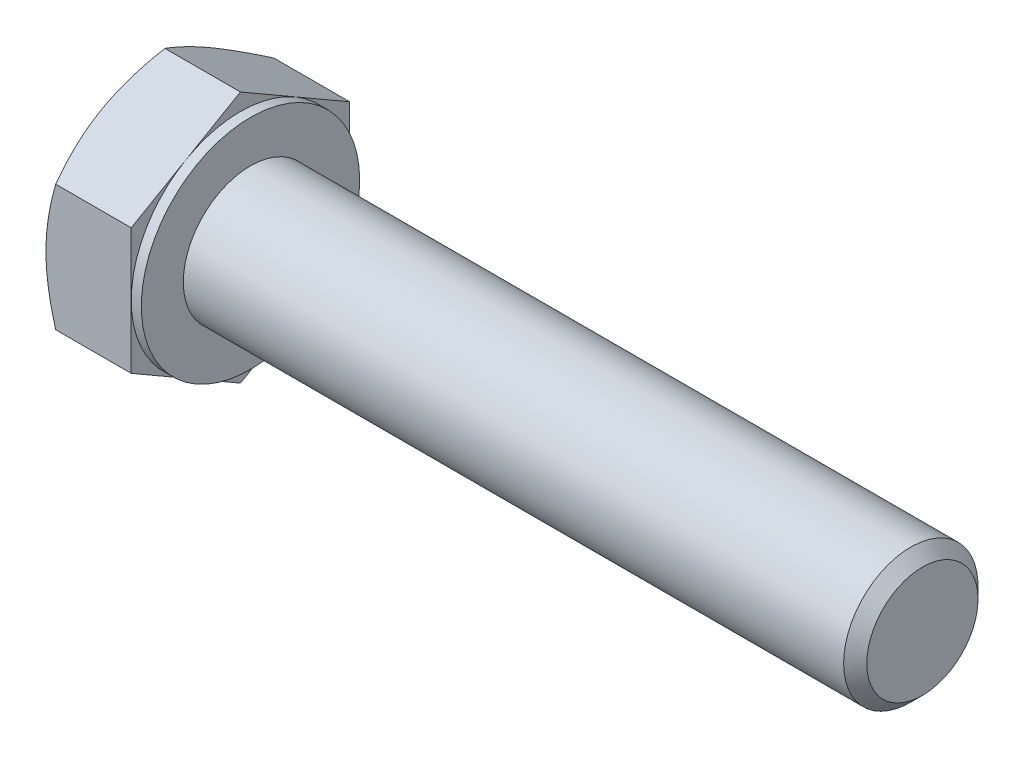
ISO-10303-21;
HEADER;
FILE_DESCRIPTION(('STEP AP214'),'2;1');
FILE_NAME('part.step','',(''),(''),'','','');
FILE_SCHEMA(('AUTOMOTIVE_DESIGN { 1 0 10303 214 1 1 1 1 }'));
ENDSEC;
DATA;
#1=APPLICATION_CONTEXT('core data for automotive mechanical design processes');
#2=APPLICATION_PROTOCOL_DEFINITION('international standard','automotive_design',2000,#1);
#3=PRODUCT_CONTEXT('',#1,'mechanical');
#4=PRODUCT('Part','Part','',(#3));
#5=PRODUCT_RELATED_PRODUCT_CATEGORY('part','',(#4));
#6=PRODUCT_DEFINITION_FORMATION('','',#4);
#7=PRODUCT_DEFINITION_CONTEXT('part definition',#1,'design');
#8=PRODUCT_DEFINITION('design','',#6,#7);
#9=PRODUCT_DEFINITION_SHAPE('','',#8);
#10=(LENGTH_UNIT() NAMED_UNIT(*) SI_UNIT(.MILLI.,.METRE.));
#11=(NAMED_UNIT(*) PLANE_ANGLE_UNIT() SI_UNIT($,.RADIAN.));
#12=(NAMED_UNIT(*) SI_UNIT($,.STERADIAN.) SOLID_ANGLE_UNIT());
#13=UNCERTAINTY_MEASURE_WITH_UNIT(LENGTH_MEASURE(1.E-05),#10,'distance_accuracy_value','');
#14=(GEOMETRIC_REPRESENTATION_CONTEXT(3) GLOBAL_UNCERTAINTY_ASSIGNED_CONTEXT((#13)) GLOBAL_UNIT_ASSIGNED_CONTEXT((#10,
#11,#12)) REPRESENTATION_CONTEXT('',''));
#15=CARTESIAN_POINT('',(0.,0.,0.));
#16=DIRECTION('',(0.,0.,1.));
#17=DIRECTION('',(1.,0.,0.));
#18=AXIS2_PLACEMENT_3D('',#15,#16,#17);
#19=CARTESIAN_POINT('',(5.675,7.50555349946514,0.));
#20=DIRECTION('',(1.,0.,0.));
#21=DIRECTION('',(0.,0.,-1.));
#22=AXIS2_PLACEMENT_3D('',#19,#20,#21);
#23=PLANE('',#22);
#24=CARTESIAN_POINT('',(5.675,0.,0.));
#25=DIRECTION('',(1.,0.,0.));
#26=DIRECTION('',(0.,0.,-1.));
#27=AXIS2_PLACEMENT_3D('',#24,#25,#26);
#28=CIRCLE('',#27,4.);
#29=CARTESIAN_POINT('',(5.675,0.,-4.));
#30=VERTEX_POINT('',#29);
#31=EDGE_CURVE('E275',#30,#30,#28,.F.);
#32=ORIENTED_EDGE('',*,*,#31,.T.);
#33=EDGE_LOOP('',(#32));
#34=FACE_BOUND('',#33,.T.);
#35=CARTESIAN_POINT('',(5.675,0.,0.));
#36=DIRECTION('',(1.,0.,0.));
#37=DIRECTION('',(0.,0.,-1.));
#38=AXIS2_PLACEMENT_3D('',#35,#36,#37);
#39=CIRCLE('',#38,6.5);
#40=CARTESIAN_POINT('',(5.675,0.,-6.5));
#41=VERTEX_POINT('',#40);
#42=EDGE_CURVE('E294',#41,#41,#39,.T.);
#43=ORIENTED_EDGE('',*,*,#42,.T.);
#44=EDGE_LOOP('',(#43));
#45=FACE_BOUND('',#44,.T.);
#46=ADVANCED_FACE('F37',(#34,#45),#23,.T.);
#47=CARTESIAN_POINT('',(0.,0.,0.));
#48=DIRECTION('',(-1.,0.,0.));
#49=DIRECTION('',(0.,0.,1.));
#50=AXIS2_PLACEMENT_3D('',#47,#48,#49);
#51=CYLINDRICAL_SURFACE('',#50,4.);
#52=ORIENTED_EDGE('',*,*,#31,.F.);
#53=EDGE_LOOP('',(#52));
#54=FACE_BOUND('',#53,.T.);
#55=CARTESIAN_POINT('',(44.9845,0.,0.));
#56=DIRECTION('',(-1.,0.,0.));
#57=DIRECTION('',(0.,0.,1.));
#58=AXIS2_PLACEMENT_3D('',#55,#56,#57);
#59=CIRCLE('',#58,4.);
#60=CARTESIAN_POINT('',(44.9845,0.,4.));
#61=VERTEX_POINT('',#60);
#62=EDGE_CURVE('E272',#61,#61,#59,.T.);
#63=ORIENTED_EDGE('',*,*,#62,.T.);
#64=EDGE_LOOP('',(#63));
#65=FACE_BOUND('',#64,.T.);
#66=ADVANCED_FACE('F246',(#54,#65),#51,.T.);
#67=CARTESIAN_POINT('',(45.675,0.,0.));
#68=DIRECTION('',(-1.,0.,0.));
#69=DIRECTION('',(0.,0.,1.));
#70=AXIS2_PLACEMENT_3D('',#67,#68,#69);
#71=CONICAL_SURFACE('',#70,3.3095,0.785398163397473);
#72=ORIENTED_EDGE('',*,*,#62,.F.);
#73=EDGE_LOOP('',(#72));
#74=FACE_BOUND('',#73,.T.);
#75=CARTESIAN_POINT('',(45.675,0.,0.));
#76=DIRECTION('',(-1.,0.,0.));
#77=DIRECTION('',(0.,0.,1.));
#78=AXIS2_PLACEMENT_3D('',#75,#76,#77);
#79=CIRCLE('',#78,3.3095);
#80=CARTESIAN_POINT('',(45.675,0.,3.3095));
#81=VERTEX_POINT('',#80);
#82=EDGE_CURVE('E270',#81,#81,#79,.T.);
#83=ORIENTED_EDGE('',*,*,#82,.T.);
#84=EDGE_LOOP('',(#83));
#85=FACE_BOUND('',#84,.T.);
#86=ADVANCED_FACE('F251',(#74,#85),#71,.T.);
#87=CARTESIAN_POINT('',(45.675,0.,0.));
#88=DIRECTION('',(-1.,0.,0.));
#89=DIRECTION('',(0.,0.,1.));
#90=AXIS2_PLACEMENT_3D('',#87,#88,#89);
#91=PLANE('',#90);
#92=ORIENTED_EDGE('',*,*,#82,.F.);
#93=EDGE_LOOP('',(#92));
#94=FACE_BOUND('',#93,.T.);
#95=ADVANCED_FACE('F258',(#94),#91,.F.);
#96=CARTESIAN_POINT('',(5.075,6.5,0.));
#97=DIRECTION('',(1.,0.,0.));
#98=DIRECTION('',(0.,0.,-1.));
#99=AXIS2_PLACEMENT_3D('',#96,#97,#98);
#100=PLANE('',#99);
#101=DIRECTION('',(0.,0.500000000000001,0.866025403784438));
#102=VECTOR('',#101,1.);
#103=CARTESIAN_POINT('',(5.075,3.75277674973256,-6.5));
#104=LINE('',#103,#102);
#105=CARTESIAN_POINT('',(5.075,3.75277674973256,-6.5));
#106=VERTEX_POINT('',#105);
#107=CARTESIAN_POINT('',(5.075,5.62916512459884,-3.25000000000001));
#108=VERTEX_POINT('',#107);
#109=EDGE_CURVE('E170',#106,#108,#104,.T.);
#110=ORIENTED_EDGE('',*,*,#109,.T.);
#111=CARTESIAN_POINT('',(5.075,0.,0.));
#112=DIRECTION('',(-1.,0.,0.));
#113=DIRECTION('',(0.,0.,1.));
#114=AXIS2_PLACEMENT_3D('',#111,#112,#113);
#115=CIRCLE('',#114,6.5);
#116=CARTESIAN_POINT('',(5.075,0.,-6.5));
#117=VERTEX_POINT('',#116);
#118=EDGE_CURVE('E53',#108,#117,#115,.T.);
#119=ORIENTED_EDGE('',*,*,#118,.T.);
#120=DIRECTION('',(0.,1.,0.));
#121=VECTOR('',#120,1.);
#122=CARTESIAN_POINT('',(5.075,3.75277674973256,-6.5));
#123=LINE('',#122,#121);
#124=EDGE_CURVE('E42',#117,#106,#123,.T.);
#125=ORIENTED_EDGE('',*,*,#124,.T.);
#126=EDGE_LOOP('',(#110,#119,#125));
#127=FACE_BOUND('',#126,.T.);
#128=ADVANCED_FACE('F261',(#127),#100,.T.);
#129=CARTESIAN_POINT('',(5.075,7.50555349946514,0.));
#130=VERTEX_POINT('',#129);
#131=EDGE_CURVE('E168',#108,#130,#104,.T.);
#132=ORIENTED_EDGE('',*,*,#131,.T.);
#133=DIRECTION('',(0.,-0.500000000000001,0.866025403784438));
#134=VECTOR('',#133,1.);
#135=CARTESIAN_POINT('',(5.075,7.50555349946514,0.));
#136=LINE('',#135,#134);
#137=CARTESIAN_POINT('',(5.075,5.62916512459885,3.25));
#138=VERTEX_POINT('',#137);
#139=EDGE_CURVE('E167',#130,#138,#136,.T.);
#140=ORIENTED_EDGE('',*,*,#139,.T.);
#141=EDGE_CURVE('E156',#138,#108,#115,.T.);
#142=ORIENTED_EDGE('',*,*,#141,.T.);
#143=EDGE_LOOP('',(#132,#140,#142));
#144=FACE_BOUND('',#143,.T.);
#145=ADVANCED_FACE('F266',(#144),#100,.T.);
#146=CARTESIAN_POINT('',(5.075,3.75277674973257,6.5));
#147=VERTEX_POINT('',#146);
#148=EDGE_CURVE('E135',#138,#147,#136,.T.);
#149=ORIENTED_EDGE('',*,*,#148,.T.);
#150=DIRECTION('',(0.,-1.,0.));
#151=VECTOR('',#150,1.);
#152=CARTESIAN_POINT('',(5.075,3.75277674973257,6.5));
#153=LINE('',#152,#151);
#154=CARTESIAN_POINT('',(5.075,0.,6.5));
#155=VERTEX_POINT('',#154);
#156=EDGE_CURVE('E129',#147,#155,#153,.T.);
#157=ORIENTED_EDGE('',*,*,#156,.T.);
#158=EDGE_CURVE('E133',#155,#138,#115,.T.);
#159=ORIENTED_EDGE('',*,*,#158,.T.);
#160=EDGE_LOOP('',(#149,#157,#159));
#161=FACE_BOUND('',#160,.T.);
#162=ADVANCED_FACE('F131',(#161),#100,.T.);
#163=CARTESIAN_POINT('',(5.075,-3.75277674973256,6.5));
#164=VERTEX_POINT('',#163);
#165=EDGE_CURVE('E139',#155,#164,#153,.T.);
#166=ORIENTED_EDGE('',*,*,#165,.T.);
#167=DIRECTION('',(0.,-0.500000000000001,-0.866025403784438));
#168=VECTOR('',#167,1.);
#169=CARTESIAN_POINT('',(5.075,-7.50555349946514,0.));
#170=LINE('',#169,#168);
#171=CARTESIAN_POINT('',(5.075,-5.62916512459884,3.25000000000001));
#172=VERTEX_POINT('',#171);
#173=EDGE_CURVE('E146',#164,#172,#170,.T.);
#174=ORIENTED_EDGE('',*,*,#173,.T.);
#175=EDGE_CURVE('E143',#172,#155,#115,.T.);
#176=ORIENTED_EDGE('',*,*,#175,.T.);
#177=EDGE_LOOP('',(#166,#174,#176));
#178=FACE_BOUND('',#177,.T.);
#179=ADVANCED_FACE('F144',(#178),#100,.T.);
#180=CARTESIAN_POINT('',(5.075,-7.50555349946514,0.));
#181=VERTEX_POINT('',#180);
#182=EDGE_CURVE('E162',#172,#181,#170,.T.);
#183=ORIENTED_EDGE('',*,*,#182,.T.);
#184=DIRECTION('',(0.,0.5,-0.866025403784439));
#185=VECTOR('',#184,1.);
#186=CARTESIAN_POINT('',(5.075,-3.75277674973257,-6.5));
#187=LINE('',#186,#185);
#188=CARTESIAN_POINT('',(5.075,-5.62916512459885,-3.25));
#189=VERTEX_POINT('',#188);
#190=EDGE_CURVE('E330',#181,#189,#187,.T.);
#191=ORIENTED_EDGE('',*,*,#190,.T.);
#192=EDGE_CURVE('E150',#189,#172,#115,.T.);
#193=ORIENTED_EDGE('',*,*,#192,.T.);
#194=EDGE_LOOP('',(#183,#191,#193));
#195=FACE_BOUND('',#194,.T.);
#196=ADVANCED_FACE('F335',(#195),#100,.T.);
#197=CARTESIAN_POINT('',(5.075,-3.75277674973258,-6.5));
#198=VERTEX_POINT('',#197);
#199=EDGE_CURVE('E157',#189,#198,#187,.T.);
#200=ORIENTED_EDGE('',*,*,#199,.T.);
#201=EDGE_CURVE('E11',#198,#117,#123,.T.);
#202=ORIENTED_EDGE('',*,*,#201,.T.);
#203=EDGE_CURVE('E348',#117,#189,#115,.T.);
#204=ORIENTED_EDGE('',*,*,#203,.T.);
#205=EDGE_LOOP('',(#200,#202,#204));
#206=FACE_BOUND('',#205,.T.);
#207=ADVANCED_FACE('F267',(#206),#100,.T.);
#208=CARTESIAN_POINT('',(0.,0.,0.));
#209=DIRECTION('',(-1.,0.,0.));
#210=DIRECTION('',(0.,0.,1.));
#211=AXIS2_PLACEMENT_3D('',#208,#209,#210);
#212=CYLINDRICAL_SURFACE('',#211,6.5);
#213=ORIENTED_EDGE('',*,*,#118,.F.);
#214=ORIENTED_EDGE('',*,*,#141,.F.);
#215=ORIENTED_EDGE('',*,*,#158,.F.);
#216=ORIENTED_EDGE('',*,*,#175,.F.);
#217=ORIENTED_EDGE('',*,*,#192,.F.);
#218=ORIENTED_EDGE('',*,*,#203,.F.);
#219=EDGE_LOOP('',(#213,#214,#215,#216,#217,#218));
#220=FACE_BOUND('',#219,.T.);
#221=ORIENTED_EDGE('',*,*,#42,.F.);
#222=EDGE_LOOP('',(#221));
#223=FACE_BOUND('',#222,.T.);
#224=ADVANCED_FACE('F153',(#220,#223),#212,.T.);
#225=CARTESIAN_POINT('',(0.,7.50555349946514,0.));
#226=DIRECTION('',(1.,0.,0.));
#227=DIRECTION('',(0.,0.,-1.));
#228=AXIS2_PLACEMENT_3D('',#225,#226,#227);
#229=PLANE('',#228);
#230=CARTESIAN_POINT('',(0.,0.,0.));
#231=DIRECTION('',(1.,0.,0.));
#232=DIRECTION('',(0.,0.,-1.));
#233=AXIS2_PLACEMENT_3D('',#230,#231,#232);
#234=CIRCLE('',#233,6.5);
#235=CARTESIAN_POINT('',(0.,0.,-6.5));
#236=VERTEX_POINT('',#235);
#237=CARTESIAN_POINT('',(0.,5.62916512459885,-3.25000000000001));
#238=VERTEX_POINT('',#237);
#239=EDGE_CURVE('E293',#236,#238,#234,.T.);
#240=ORIENTED_EDGE('',*,*,#239,.F.);
#241=CARTESIAN_POINT('',(0.,-5.62916512459885,-3.25));
#242=VERTEX_POINT('',#241);
#243=EDGE_CURVE('E290',#242,#236,#234,.T.);
#244=ORIENTED_EDGE('',*,*,#243,.F.);
#245=CARTESIAN_POINT('',(0.,-5.62916512459884,3.25000000000001));
#246=VERTEX_POINT('',#245);
#247=EDGE_CURVE('E292',#246,#242,#234,.T.);
#248=ORIENTED_EDGE('',*,*,#247,.F.);
#249=CARTESIAN_POINT('',(0.,0.,6.5));
#250=VERTEX_POINT('',#249);
#251=EDGE_CURVE('E302',#250,#246,#234,.T.);
#252=ORIENTED_EDGE('',*,*,#251,.F.);
#253=CARTESIAN_POINT('',(0.,0.,0.));
#254=DIRECTION('',(-1.,0.,0.));
#255=DIRECTION('',(0.,0.,1.));
#256=AXIS2_PLACEMENT_3D('',#253,#254,#255);
#257=CIRCLE('',#256,6.5);
#258=CARTESIAN_POINT('',(0.,5.62916512459885,3.25));
#259=VERTEX_POINT('',#258);
#260=EDGE_CURVE('E171',#250,#259,#257,.T.);
#261=ORIENTED_EDGE('',*,*,#260,.T.);
#262=EDGE_CURVE('E297',#238,#259,#234,.T.);
#263=ORIENTED_EDGE('',*,*,#262,.F.);
#264=EDGE_LOOP('',(#240,#244,#248,#252,#261,#263));
#265=FACE_BOUND('',#264,.T.);
#266=ADVANCED_FACE('F200',(#265),#229,.F.);
#267=CARTESIAN_POINT('',(0.,0.,0.));
#268=DIRECTION('',(1.,0.,0.));
#269=DIRECTION('',(0.,0.,-1.));
#270=AXIS2_PLACEMENT_3D('',#267,#268,#269);
#271=CONICAL_SURFACE('',#270,6.5,1.0471975511966);
#272=CARTESIAN_POINT('',(0.580623251805865,3.75266127967873,6.5002));
#273=CARTESIAN_POINT('',(0.533004423075483,3.8351516191275,6.35732254094111));
#274=CARTESIAN_POINT('',(0.487546700602704,3.91794952254312,6.21391236546508));
#275=CARTESIAN_POINT('',(0.401548682023044,4.08421773795795,5.9259273686828));
#276=CARTESIAN_POINT('',(0.361010507228023,4.16768832359105,5.78135207342873));
#277=CARTESIAN_POINT('',(0.247571001123206,4.41943655294051,5.34531134947996));
#278=CARTESIAN_POINT('',(0.183047807128738,4.5887079340369,5.05212471715368));
#279=CARTESIAN_POINT('',(0.107386583547491,4.84201947708215,4.61337625445562));
#280=CARTESIAN_POINT('',(0.0858328564569876,4.92530276780316,4.46912536350531));
#281=CARTESIAN_POINT('',(0.0496903146061196,5.09224566542477,4.17997178286191));
#282=CARTESIAN_POINT('',(0.0351008844596672,5.17590523841627,4.03506915190111));
#283=CARTESIAN_POINT('',(0.0132587525073475,5.34336968579964,3.74501222057168));
#284=CARTESIAN_POINT('',(0.00599772432210866,5.427174286676,3.59985839394579));
#285=CARTESIAN_POINT('',(-0.00103969741776764,5.59485627940484,3.30942466302505));
#286=CARTESIAN_POINT('',(-0.000816322187794413,5.6787336689286,3.16414476276364));
#287=CARTESIAN_POINT('',(0.0100834585151662,5.90853103021317,2.7661240575735));
#288=CARTESIAN_POINT('',(0.0283818178694145,6.05437578112764,2.51351353897243));
#289=CARTESIAN_POINT('',(0.0864063414576768,6.34509659313135,2.00997032176432));
#290=CARTESIAN_POINT('',(0.126152338538247,6.48997163178545,1.75903939406692));
#291=CARTESIAN_POINT('',(0.225505903202152,6.78127752911039,1.25448277935568));
#292=CARTESIAN_POINT('',(0.285534425638029,6.92767163007068,1.00092075856409));
#293=CARTESIAN_POINT('',(0.421774992509871,7.21827667013277,0.497578064240954));
#294=CARTESIAN_POINT('',(0.497955034163596,7.36249133098589,0.247790944447036));
#295=CARTESIAN_POINT('',(0.58062325180587,7.50566896951898,-0.000200000000000139));
#296=B_SPLINE_CURVE_WITH_KNOTS('',3,(#272,#273,#274,#275,#276,#277,#278,#279,#280,#281,#282,
#283,#284,#285,#286,#287,#288,#289,#290,#291,#292,#293,#294,#295),.UNSPECIFIED.,.F.,.F.,(4,2,2,
2,2,2,2,2,2,2,2,4),(0.,0.515105052395588,1.03043143507524,2.06322554824262,2.56697389547996,
3.07067772176453,3.57380860368928,4.0769239424252,4.9527935470566,5.82947446853466,
6.72559912449736,7.61996451221045),.UNSPECIFIED.);
#297=CARTESIAN_POINT('',(0.580556583600766,7.50555349946514,0.));
#298=VERTEX_POINT('',#297);
#299=EDGE_CURVE('E218',#259,#298,#296,.T.);
#300=ORIENTED_EDGE('',*,*,#299,.T.);
#301=CARTESIAN_POINT('',(0.58062325180587,7.50566896951898,0.0002));
#302=CARTESIAN_POINT('',(0.533004423075489,7.4231786300702,-0.14267745905888));
#303=CARTESIAN_POINT('',(0.487546700602709,7.34038072665458,-0.286087634534913));
#304=CARTESIAN_POINT('',(0.401548682023048,7.17411251123976,-0.574072631317195));
#305=CARTESIAN_POINT('',(0.361010507228027,7.09064192560665,-0.718647926571264));
#306=CARTESIAN_POINT('',(0.24757100112321,6.83889369625719,-1.15468865052003));
#307=CARTESIAN_POINT('',(0.183047807128741,6.66962231516081,-1.44787528284632));
#308=CARTESIAN_POINT('',(0.107386583547493,6.41631077211555,-1.88662374554437));
#309=CARTESIAN_POINT('',(0.0858328564569886,6.33302748139454,-2.03087463649469));
#310=CARTESIAN_POINT('',(0.0496903146061197,6.16608458377293,-2.32002821713809));
#311=CARTESIAN_POINT('',(0.0351008844596672,6.08242501078143,-2.46493084809889));
#312=CARTESIAN_POINT('',(0.0132587525073473,5.91496056339806,-2.75498777942832));
#313=CARTESIAN_POINT('',(0.00599772432210838,5.8311559625217,-2.90014160605421));
#314=CARTESIAN_POINT('',(-0.00103969741776837,5.66347396979287,-3.19057533697495));
#315=CARTESIAN_POINT('',(-0.000816322187795481,5.5795965802691,-3.33585523723636));
#316=CARTESIAN_POINT('',(0.0100834585151643,5.34979921898453,-3.73387594242649));
#317=CARTESIAN_POINT('',(0.028381817869412,5.20395446807007,-3.98648646102757));
#318=CARTESIAN_POINT('',(0.0864063414576733,4.91323365606635,-4.49002967823568));
#319=CARTESIAN_POINT('',(0.126152338538243,4.76835861741225,-4.74096060593308));
#320=CARTESIAN_POINT('',(0.225505903202147,4.47705272008731,-5.24551722064432));
#321=CARTESIAN_POINT('',(0.285534425638024,4.33065861912702,-5.49907924143591));
#322=CARTESIAN_POINT('',(0.421774992509866,4.04005357906493,-6.00242193575904));
#323=CARTESIAN_POINT('',(0.49795503416359,3.89583891821181,-6.25220905555296));
#324=CARTESIAN_POINT('',(0.580623251805864,3.75266127967872,-6.5002));
#325=B_SPLINE_CURVE_WITH_KNOTS('',3,(#301,#302,#303,#304,#305,#306,#307,#308,#309,#310,#311,
#312,#313,#314,#315,#316,#317,#318,#319,#320,#321,#322,#323,#324),.UNSPECIFIED.,.F.,.F.,(4,2,2,
2,2,2,2,2,2,2,2,4),(0.,0.515105052395588,1.03043143507525,2.06322554824262,2.56697389547997,
3.07067772176454,3.57380860368928,4.0769239424252,4.9527935470566,5.82947446853467,
6.72559912449737,7.61996451221046),.UNSPECIFIED.);
#326=EDGE_CURVE('E61',#298,#238,#325,.T.);
#327=ORIENTED_EDGE('',*,*,#326,.T.);
#328=ORIENTED_EDGE('',*,*,#262,.T.);
#329=EDGE_LOOP('',(#300,#327,#328));
#330=FACE_BOUND('',#329,.T.);
#331=ADVANCED_FACE('F344',(#330),#271,.T.);
#332=CARTESIAN_POINT('',(3.18835311590245,-10.1137456678934,6.5));
#333=CARTESIAN_POINT('',(3.05034774010467,-9.82952666322136,6.5));
#334=CARTESIAN_POINT('',(2.91365616489937,-9.54465869649271,6.5));
#335=CARTESIAN_POINT('',(2.6436389949754,-8.97327978057919,6.5));
#336=CARTESIAN_POINT('',(2.51031392459096,-8.6867685838847,6.5));
#337=CARTESIAN_POINT('',(2.24710473482718,-8.11029837842687,6.5));
#338=CARTESIAN_POINT('',(2.11724300438679,-7.82032911201509,6.5));
#339=CARTESIAN_POINT('',(1.86279082826902,-7.23809541022337,6.5));
#340=CARTESIAN_POINT('',(1.73820013554673,-6.94583108317205,6.5));
#341=CARTESIAN_POINT('',(1.49176685426961,-6.34906440963034,6.5));
#342=CARTESIAN_POINT('',(1.37014257641265,-6.0444714228887,6.5));
#343=CARTESIAN_POINT('',(1.13601865758149,-5.43173420957314,6.5));
#344=CARTESIAN_POINT('',(1.02352003558022,-5.12358959079844,6.5));
#345=CARTESIAN_POINT('',(0.810575368239912,-4.50382569782258,6.5));
#346=CARTESIAN_POINT('',(0.710105232302001,-4.19221478266991,6.5));
#347=CARTESIAN_POINT('',(0.52442016614445,-3.56452019206011,6.5));
#348=CARTESIAN_POINT('',(0.439200468206414,-3.24843794792919,6.5));
#349=CARTESIAN_POINT('',(0.288524223401194,-2.61335465712781,6.5));
#350=CARTESIAN_POINT('',(0.222961865744746,-2.29437912059504,6.5));
#351=CARTESIAN_POINT('',(0.115312883130723,-1.65238219405861,6.5));
#352=CARTESIAN_POINT('',(0.0732239014690614,-1.32936121354429,6.5));
#353=CARTESIAN_POINT('',(0.0304887136381649,-0.845231171839972,6.5));
#354=CARTESIAN_POINT('',(0.0196493434273828,-0.68498220966309,6.5));
#355=CARTESIAN_POINT('',(0.00475298486143907,-0.364162349065447,6.5));
#356=CARTESIAN_POINT('',(0.000695882908831708,-0.203591456081867,6.5));
#357=CARTESIAN_POINT('',(-0.000531597190095149,0.11757743037431,6.5));
#358=CARTESIAN_POINT('',(0.00229809017012659,0.278175424090156,6.5));
#359=CARTESIAN_POINT('',(0.0147726845547636,0.599108972823518,6.5));
#360=CARTESIAN_POINT('',(0.0244179260500516,0.75944451457423,6.5));
#361=CARTESIAN_POINT('',(0.0554961939343005,1.14369946602535,6.5));
#362=CARTESIAN_POINT('',(0.0801030490514526,1.36736763045087,6.5));
#363=CARTESIAN_POINT('',(0.141246537453379,1.81305591311689,6.5));
#364=CARTESIAN_POINT('',(0.177784759614453,2.0350758078311,6.5));
#365=CARTESIAN_POINT('',(0.303360001332117,2.69839633433797,6.5));
#366=CARTESIAN_POINT('',(0.408335815147597,3.13672010374358,6.5));
#367=CARTESIAN_POINT('',(0.590564593134944,3.7923211291812,6.5));
#368=CARTESIAN_POINT('',(0.656313198979095,4.01299150874074,6.5));
#369=CARTESIAN_POINT('',(0.794681634200735,4.45218859008392,6.5));
#370=CARTESIAN_POINT('',(0.867301513122621,4.6707152763982,6.49999999999999));
#371=CARTESIAN_POINT('',(1.01824353854295,5.10569490252728,6.49999999999999));
#372=CARTESIAN_POINT('',(1.09656388232839,5.32214847365077,6.49999999999999));
#373=CARTESIAN_POINT('',(1.25798086164822,5.75325725773041,6.49999999999999));
#374=CARTESIAN_POINT('',(1.34107741035996,5.96791250329558,6.49999999999999));
#375=CARTESIAN_POINT('',(1.56029019583041,6.51888445936374,6.49999999999999));
#376=CARTESIAN_POINT('',(1.69936356666534,6.85402316813628,6.49999999999999));
#377=CARTESIAN_POINT('',(1.98501958087353,7.52109583939394,6.49999999999999));
#378=CARTESIAN_POINT('',(2.13160288780792,7.85302951559934,6.49999999999999));
#379=CARTESIAN_POINT('',(2.43059748044952,8.51437865518659,6.49999999999999));
#380=CARTESIAN_POINT('',(2.5830105759696,8.84379329784094,6.49999999999999));
#381=CARTESIAN_POINT('',(2.89234869374927,9.50047798683785,6.49999999999999));
#382=CARTESIAN_POINT('',(3.04927357220059,9.82774810112758,6.49999999999999));
#383=CARTESIAN_POINT('',(3.36692013130636,10.4809971975748,6.49999999999999));
#384=CARTESIAN_POINT('',(3.52764676491733,10.8069737667408,6.49999999999999));
#385=CARTESIAN_POINT('',(3.85198555554899,11.4574882901034,6.49999999999999));
#386=CARTESIAN_POINT('',(4.01559773123065,11.7820262349792,6.49999999999999));
#387=CARTESIAN_POINT('',(4.50986185003773,12.7537468114441,6.49999999999999));
#388=CARTESIAN_POINT('',(4.8439999797854,13.3991555932469,6.49999999999999));
#389=CARTESIAN_POINT('',(5.48575990265919,14.6239779290894,6.49999999999999));
#390=CARTESIAN_POINT('',(5.79279643372278,15.2036995760604,6.49999999999999));
#391=CARTESIAN_POINT('',(6.4106918822763,16.3611382637875,6.49999999999999));
#392=CARTESIAN_POINT('',(6.72155099010109,16.938855202873,6.49999999999999));
#393=CARTESIAN_POINT('',(7.34519775439014,18.0910273555999,6.49999999999999));
#394=CARTESIAN_POINT('',(7.65797694168864,18.665487160613,6.49999999999999));
#395=CARTESIAN_POINT('',(8.28574397153078,19.8131486204439,6.49999999999999));
#396=CARTESIAN_POINT('',(8.60073166294278,20.3863503578957,6.49999999999999));
#397=CARTESIAN_POINT('',(8.91652967168741,20.9591024521449,6.49999999999999));
#398=B_SPLINE_CURVE_WITH_KNOTS('',3,(#332,#333,#334,#335,#336,#337,#338,#339,#340,#341,#342,
#343,#344,#345,#346,#347,#348,#349,#350,#351,#352,#353,#354,#355,#356,#357,#358,#359,#360,#361,
#362,#363,#364,#365,#366,#367,#368,#369,#370,#371,#372,#373,#374,#375,#376,#377,#378,#379,#380,
#381,#382,#383,#384,#385,#386,#387,#388,#389,#390,#391,#392,#393,#394,#395,#396,#397),
.UNSPECIFIED.,.F.,.F.,(4,2,2,2,2,2,2,2,2,2,2,2,2,2,2,2,2,2,2,2,2,2,2,2,2,2,2,2,2,2,2,2,4),(0.,
0.947868666702312,1.89588406483492,2.84900320930536,3.80207763304314,4.7858977408271,
5.76982755141751,6.75175256246684,7.73337005764393,8.7096047489099,9.68574140951123,
10.1674651053568,10.6491807326436,11.1309009419855,11.6126447932157,12.287317572382,
12.9620802330383,14.312318438093,15.0030310344276,15.6937486114326,16.384248697357,
17.0747362352244,18.1631508683747,19.2516618378193,20.3405135142583,21.4293305231019,
22.5196540547636,23.6099846401957,25.7902468235016,27.7582608872417,29.7263733429304,
31.6886408595598,33.6507753806319),.UNSPECIFIED.);
#399=CARTESIAN_POINT('',(0.580556583600761,3.75277674973257,6.5));
#400=VERTEX_POINT('',#399);
#401=EDGE_CURVE('E230',#250,#400,#398,.T.);
#402=ORIENTED_EDGE('',*,*,#401,.T.);
#403=EDGE_CURVE('E229',#400,#259,#296,.T.);
#404=ORIENTED_EDGE('',*,*,#403,.T.);
#405=ORIENTED_EDGE('',*,*,#260,.F.);
#406=EDGE_LOOP('',(#402,#404,#405));
#407=FACE_BOUND('',#406,.T.);
#408=ADVANCED_FACE('F340',(#407),#271,.T.);
#409=CARTESIAN_POINT('',(0.580556583600759,-3.75277674973256,6.5));
#410=VERTEX_POINT('',#409);
#411=EDGE_CURVE('E273',#410,#250,#398,.T.);
#412=ORIENTED_EDGE('',*,*,#411,.T.);
#413=ORIENTED_EDGE('',*,*,#251,.T.);
#414=CARTESIAN_POINT('',(0.580623251805869,-7.50566896951898,-0.000199999999999968));
#415=CARTESIAN_POINT('',(0.533004423075487,-7.4231786300702,0.14267745905888));
#416=CARTESIAN_POINT('',(0.487546700602708,-7.34038072665458,0.286087634534912));
#417=CARTESIAN_POINT('',(0.401548682023047,-7.17411251123976,0.574072631317194));
#418=CARTESIAN_POINT('',(0.361010507228026,-7.09064192560665,0.718647926571263));
#419=CARTESIAN_POINT('',(0.247571001123209,-6.83889369625719,1.15468865052003));
#420=CARTESIAN_POINT('',(0.183047807128739,-6.66962231516081,1.44787528284632));
#421=CARTESIAN_POINT('',(0.107386583547491,-6.41631077211555,1.88662374554437));
#422=CARTESIAN_POINT('',(0.0858328564569876,-6.33302748139454,2.03087463649469));
#423=CARTESIAN_POINT('',(0.0496903146061189,-6.16608458377293,2.32002821713809));
#424=CARTESIAN_POINT('',(0.0351008844596662,-6.08242501078143,2.46493084809889));
#425=CARTESIAN_POINT('',(0.0132587525073458,-5.91496056339806,2.75498777942832));
#426=CARTESIAN_POINT('',(0.0059977243221065,-5.8311559625217,2.90014160605421));
#427=CARTESIAN_POINT('',(-0.00103969741777025,-5.66347396979286,3.19057533697495));
#428=CARTESIAN_POINT('',(-0.000816322187797038,-5.5795965802691,3.33585523723636));
#429=CARTESIAN_POINT('',(0.0100834585151632,-5.34979921898453,3.73387594242649));
#430=CARTESIAN_POINT('',(0.0283818178694109,-5.20395446807006,3.98648646102757));
#431=CARTESIAN_POINT('',(0.0864063414576719,-4.91323365606635,4.49002967823568));
#432=CARTESIAN_POINT('',(0.126152338538241,-4.76835861741225,4.74096060593308));
#433=CARTESIAN_POINT('',(0.225505903202146,-4.47705272008731,5.24551722064432));
#434=CARTESIAN_POINT('',(0.285534425638023,-4.33065861912702,5.49907924143591));
#435=CARTESIAN_POINT('',(0.421774992509865,-4.04005357906493,6.00242193575904));
#436=CARTESIAN_POINT('',(0.497955034163589,-3.8958389182118,6.25220905555296));
#437=CARTESIAN_POINT('',(0.580623251805863,-3.75266127967872,6.5002));
#438=B_SPLINE_CURVE_WITH_KNOTS('',3,(#414,#415,#416,#417,#418,#419,#420,#421,#422,#423,#424,
#425,#426,#427,#428,#429,#430,#431,#432,#433,#434,#435,#436,#437),.UNSPECIFIED.,.F.,.F.,(4,2,2,
2,2,2,2,2,2,2,2,4),(0.,0.515105052395587,1.03043143507524,2.06322554824262,2.56697389547996,
3.07067772176454,3.57380860368928,4.0769239424252,4.9527935470566,5.82947446853467,
6.72559912449737,7.61996451221046),.UNSPECIFIED.);
#439=EDGE_CURVE('E220',#246,#410,#438,.T.);
#440=ORIENTED_EDGE('',*,*,#439,.T.);
#441=EDGE_LOOP('',(#412,#413,#440));
#442=FACE_BOUND('',#441,.T.);
#443=ADVANCED_FACE('F189',(#442),#271,.T.);
#444=CARTESIAN_POINT('',(0.580556583600764,-7.50555349946514,0.));
#445=VERTEX_POINT('',#444);
#446=EDGE_CURVE('E213',#445,#246,#438,.T.);
#447=ORIENTED_EDGE('',*,*,#446,.T.);
#448=ORIENTED_EDGE('',*,*,#247,.T.);
#449=CARTESIAN_POINT('',(0.580623251805869,-3.75266127967874,-6.5002));
#450=CARTESIAN_POINT('',(0.533004423075487,-3.83515161912751,-6.35732254094112));
#451=CARTESIAN_POINT('',(0.487546700602708,-3.91794952254313,-6.21391236546509));
#452=CARTESIAN_POINT('',(0.401548682023048,-4.08421773795795,-5.9259273686828));
#453=CARTESIAN_POINT('',(0.361010507228027,-4.16768832359106,-5.78135207342874));
#454=CARTESIAN_POINT('',(0.247571001123211,-4.41943655294052,-5.34531134947996));
#455=CARTESIAN_POINT('',(0.183047807128742,-4.5887079340369,-5.05212471715368));
#456=CARTESIAN_POINT('',(0.107386583547494,-4.84201947708216,-4.61337625445563));
#457=CARTESIAN_POINT('',(0.0858328564569903,-4.92530276780317,-4.46912536350531));
#458=CARTESIAN_POINT('',(0.0496903146061218,-5.09224566542478,-4.17997178286191));
#459=CARTESIAN_POINT('',(0.0351008844596693,-5.17590523841628,-4.03506915190111));
#460=CARTESIAN_POINT('',(0.0132587525073497,-5.34336968579964,-3.74501222057168));
#461=CARTESIAN_POINT('',(0.00599772432211093,-5.42717428667601,-3.59985839394579));
#462=CARTESIAN_POINT('',(-0.00103969741776541,-5.59485627940484,-3.30942466302505));
#463=CARTESIAN_POINT('',(-0.000816322187792292,-5.67873366892861,-3.16414476276364));
#464=CARTESIAN_POINT('',(0.010083458515168,-5.90853103021318,-2.7661240575735));
#465=CARTESIAN_POINT('',(0.0283818178694159,-6.05437578112764,-2.51351353897243));
#466=CARTESIAN_POINT('',(0.0864063414576779,-6.34509659313135,-2.00997032176432));
#467=CARTESIAN_POINT('',(0.126152338538248,-6.48997163178545,-1.75903939406691));
#468=CARTESIAN_POINT('',(0.225505903202152,-6.78127752911039,-1.25448277935568));
#469=CARTESIAN_POINT('',(0.285534425638029,-6.92767163007068,-1.00092075856408));
#470=CARTESIAN_POINT('',(0.421774992509871,-7.21827667013277,-0.497578064240953));
#471=CARTESIAN_POINT('',(0.497955034163595,-7.36249133098589,-0.247790944447035));
#472=CARTESIAN_POINT('',(0.580623251805869,-7.50566896951898,0.000200000000001015));
#473=B_SPLINE_CURVE_WITH_KNOTS('',3,(#449,#450,#451,#452,#453,#454,#455,#456,#457,#458,#459,
#460,#461,#462,#463,#464,#465,#466,#467,#468,#469,#470,#471,#472),.UNSPECIFIED.,.F.,.F.,(4,2,2,
2,2,2,2,2,2,2,2,4),(0.,0.515105052395587,1.03043143507525,2.06322554824262,2.56697389547997,
3.07067772176454,3.57380860368928,4.0769239424252,4.9527935470566,5.82947446853466,
6.72559912449736,7.61996451221045),.UNSPECIFIED.);
#474=EDGE_CURVE('E219',#242,#445,#473,.T.);
#475=ORIENTED_EDGE('',*,*,#474,.T.);
#476=EDGE_LOOP('',(#447,#448,#475));
#477=FACE_BOUND('',#476,.T.);
#478=ADVANCED_FACE('F311',(#477),#271,.T.);
#479=CARTESIAN_POINT('',(0.58055658360076,3.75277674973256,-6.5));
#480=VERTEX_POINT('',#479);
#481=EDGE_CURVE('E221',#238,#480,#325,.T.);
#482=ORIENTED_EDGE('',*,*,#481,.T.);
#483=CARTESIAN_POINT('',(3.18835311590246,-10.1137456678934,-6.5));
#484=CARTESIAN_POINT('',(3.05034774010468,-9.82952666322138,-6.5));
#485=CARTESIAN_POINT('',(2.91365616489938,-9.54465869649274,-6.5));
#486=CARTESIAN_POINT('',(2.64363899497542,-8.97327978057922,-6.5));
#487=CARTESIAN_POINT('',(2.51031392459097,-8.68676858388472,-6.5));
#488=CARTESIAN_POINT('',(2.24710473482719,-8.11029837842689,-6.5));
#489=CARTESIAN_POINT('',(2.1172430043868,-7.82032911201512,-6.5));
#490=CARTESIAN_POINT('',(1.86279082826903,-7.2380954102234,-6.5));
#491=CARTESIAN_POINT('',(1.73820013554674,-6.94583108317207,-6.5));
#492=CARTESIAN_POINT('',(1.49176685426962,-6.34906440963036,-6.5));
#493=CARTESIAN_POINT('',(1.37014257641266,-6.04447142288872,-6.5));
#494=CARTESIAN_POINT('',(1.13601865758149,-5.43173420957316,-6.5));
#495=CARTESIAN_POINT('',(1.02352003558022,-5.12358959079846,-6.5));
#496=CARTESIAN_POINT('',(0.810575368239919,-4.5038256978226,-6.5));
#497=CARTESIAN_POINT('',(0.710105232302006,-4.19221478266993,-6.5));
#498=CARTESIAN_POINT('',(0.524420166144455,-3.56452019206012,-6.5));
#499=CARTESIAN_POINT('',(0.439200468206419,-3.24843794792921,-6.5));
#500=CARTESIAN_POINT('',(0.288524223401199,-2.61335465712783,-6.5));
#501=CARTESIAN_POINT('',(0.22296186574475,-2.29437912059505,-6.5));
#502=CARTESIAN_POINT('',(0.115312883130726,-1.65238219405862,-6.5));
#503=CARTESIAN_POINT('',(0.0732239014690641,-1.3293612135443,-6.5));
#504=CARTESIAN_POINT('',(0.0304887136381671,-0.845231171839983,-6.5));
#505=CARTESIAN_POINT('',(0.0196493434273849,-0.6849822096631,-6.5));
#506=CARTESIAN_POINT('',(0.00475298486144085,-0.364162349065458,-6.5));
#507=CARTESIAN_POINT('',(0.000695882908833256,-0.203591456081877,-6.5));
#508=CARTESIAN_POINT('',(-0.000531597190093703,0.117577430374299,-6.5));
#509=CARTESIAN_POINT('',(0.00229809017012816,0.278175424090145,-6.5));
#510=CARTESIAN_POINT('',(0.0147726845547651,0.599108972823508,-6.5));
#511=CARTESIAN_POINT('',(0.024417926050053,0.75944451457422,-6.5));
#512=CARTESIAN_POINT('',(0.0554961939343012,1.14369946602534,-6.5));
#513=CARTESIAN_POINT('',(0.0801030490514526,1.36736763045086,-6.5));
#514=CARTESIAN_POINT('',(0.141246537453378,1.81305591311688,-6.5));
#515=CARTESIAN_POINT('',(0.177784759614453,2.03507580783108,-6.5));
#516=CARTESIAN_POINT('',(0.303360001332116,2.69839633433796,-6.5));
#517=CARTESIAN_POINT('',(0.408335815147595,3.13672010374357,-6.5));
#518=CARTESIAN_POINT('',(0.590564593134941,3.79232112918118,-6.5));
#519=CARTESIAN_POINT('',(0.656313198979092,4.01299150874073,-6.5));
#520=CARTESIAN_POINT('',(0.794681634200733,4.45218859008391,-6.5));
#521=CARTESIAN_POINT('',(0.867301513122619,4.67071527639819,-6.5));
#522=CARTESIAN_POINT('',(1.01824353854295,5.10569490252726,-6.5));
#523=CARTESIAN_POINT('',(1.09656388232839,5.32214847365076,-6.5));
#524=CARTESIAN_POINT('',(1.25798086164821,5.75325725773039,-6.5));
#525=CARTESIAN_POINT('',(1.34107741035995,5.96791250329556,-6.5));
#526=CARTESIAN_POINT('',(1.56029019583041,6.51888445936372,-6.5));
#527=CARTESIAN_POINT('',(1.69936356666534,6.85402316813626,-6.5));
#528=CARTESIAN_POINT('',(1.98501958087353,7.52109583939393,-6.5));
#529=CARTESIAN_POINT('',(2.13160288780791,7.85302951559933,-6.5));
#530=CARTESIAN_POINT('',(2.43059748044951,8.51437865518657,-6.5));
#531=CARTESIAN_POINT('',(2.58301057596959,8.84379329784094,-6.5));
#532=CARTESIAN_POINT('',(2.89234869374926,9.50047798683784,-6.5));
#533=CARTESIAN_POINT('',(3.04927357220059,9.82774810112757,-6.5));
#534=CARTESIAN_POINT('',(3.36692013130637,10.4809971975748,-6.5));
#535=CARTESIAN_POINT('',(3.52764676491733,10.8069737667408,-6.5));
#536=CARTESIAN_POINT('',(3.851985555549,11.4574882901034,-6.5));
#537=CARTESIAN_POINT('',(4.01559773123066,11.7820262349792,-6.5));
#538=CARTESIAN_POINT('',(4.50986185003773,12.7537468114441,-6.5));
#539=CARTESIAN_POINT('',(4.84399997978541,13.3991555932469,-6.5));
#540=CARTESIAN_POINT('',(5.48575990265919,14.6239779290894,-6.5));
#541=CARTESIAN_POINT('',(5.79279643372278,15.2036995760604,-6.5));
#542=CARTESIAN_POINT('',(6.4106918822763,16.3611382637875,-6.5));
#543=CARTESIAN_POINT('',(6.72155099010109,16.938855202873,-6.5));
#544=CARTESIAN_POINT('',(7.34519775439014,18.0910273555999,-6.5));
#545=CARTESIAN_POINT('',(7.65797694168864,18.665487160613,-6.5));
#546=CARTESIAN_POINT('',(8.28574397153078,19.8131486204439,-6.5));
#547=CARTESIAN_POINT('',(8.60073166294278,20.3863503578957,-6.5));
#548=CARTESIAN_POINT('',(8.91652967168741,20.9591024521449,-6.49999999999999));
#549=B_SPLINE_CURVE_WITH_KNOTS('',3,(#483,#484,#485,#486,#487,#488,#489,#490,#491,#492,#493,
#494,#495,#496,#497,#498,#499,#500,#501,#502,#503,#504,#505,#506,#507,#508,#509,#510,#511,#512,
#513,#514,#515,#516,#517,#518,#519,#520,#521,#522,#523,#524,#525,#526,#527,#528,#529,#530,#531,
#532,#533,#534,#535,#536,#537,#538,#539,#540,#541,#542,#543,#544,#545,#546,#547,#548),
.UNSPECIFIED.,.F.,.F.,(4,2,2,2,2,2,2,2,2,2,2,2,2,2,2,2,2,2,2,2,2,2,2,2,2,2,2,2,2,2,2,2,4),(0.,
0.947868666702308,1.89588406483492,2.84900320930536,3.80207763304314,4.7858977408271,
5.76982755141752,6.75175256246685,7.73337005764394,8.70960474890991,9.68574140951124,
10.1674651053568,10.6491807326436,11.1309009419855,11.6126447932157,12.287317572382,
12.9620802330384,14.312318438093,15.0030310344276,15.6937486114326,16.3842486973571,
17.0747362352244,18.1631508683747,19.2516618378194,20.3405135142583,21.4293305231019,
22.5196540547637,23.6099846401957,25.7902468235017,27.7582608872418,29.7263733429304,
31.6886408595598,33.6507753806319),.UNSPECIFIED.);
#550=EDGE_CURVE('E182',#480,#236,#549,.F.);
#551=ORIENTED_EDGE('',*,*,#550,.T.);
#552=ORIENTED_EDGE('',*,*,#239,.T.);
#553=EDGE_LOOP('',(#482,#551,#552));
#554=FACE_BOUND('',#553,.T.);
#555=ADVANCED_FACE('F325',(#554),#271,.T.);
#556=CARTESIAN_POINT('',(0.580556583600765,-3.75277674973257,-6.5));
#557=VERTEX_POINT('',#556);
#558=EDGE_CURVE('E183',#557,#242,#473,.T.);
#559=ORIENTED_EDGE('',*,*,#558,.T.);
#560=ORIENTED_EDGE('',*,*,#243,.T.);
#561=EDGE_CURVE('E174',#236,#557,#549,.F.);
#562=ORIENTED_EDGE('',*,*,#561,.T.);
#563=EDGE_LOOP('',(#559,#560,#562));
#564=FACE_BOUND('',#563,.T.);
#565=ADVANCED_FACE('F198',(#564),#271,.T.);
#566=CARTESIAN_POINT('',(5.675,3.75277674973256,-6.5));
#567=DIRECTION('',(0.,0.,1.));
#568=DIRECTION('',(0.,-1.,0.));
#569=AXIS2_PLACEMENT_3D('',#566,#567,#568);
#570=PLANE('',#569);
#571=ORIENTED_EDGE('',*,*,#201,.F.);
#572=DIRECTION('',(-1.,0.,0.));
#573=VECTOR('',#572,1.);
#574=CARTESIAN_POINT('',(5.675,-3.75277674973257,-6.5));
#575=LINE('',#574,#573);
#576=EDGE_CURVE('E281',#198,#557,#575,.T.);
#577=ORIENTED_EDGE('',*,*,#576,.T.);
#578=ORIENTED_EDGE('',*,*,#561,.F.);
#579=ORIENTED_EDGE('',*,*,#550,.F.);
#580=DIRECTION('',(-1.,0.,0.));
#581=VECTOR('',#580,1.);
#582=CARTESIAN_POINT('',(5.675,3.75277674973256,-6.5));
#583=LINE('',#582,#581);
#584=EDGE_CURVE('E279',#106,#480,#583,.T.);
#585=ORIENTED_EDGE('',*,*,#584,.F.);
#586=ORIENTED_EDGE('',*,*,#124,.F.);
#587=EDGE_LOOP('',(#571,#577,#578,#579,#585,#586));
#588=FACE_BOUND('',#587,.T.);
#589=ADVANCED_FACE('F193',(#588),#570,.F.);
#590=CARTESIAN_POINT('',(5.675,-3.75277674973257,-6.5));
#591=DIRECTION('',(0.,0.866025403784439,0.5));
#592=DIRECTION('',(0.,-0.5,0.866025403784439));
#593=AXIS2_PLACEMENT_3D('',#590,#591,#592);
#594=PLANE('',#593);
#595=ORIENTED_EDGE('',*,*,#190,.F.);
#596=DIRECTION('',(-1.,0.,0.));
#597=VECTOR('',#596,1.);
#598=CARTESIAN_POINT('',(5.675,-7.50555349946514,0.));
#599=LINE('',#598,#597);
#600=EDGE_CURVE('E283',#181,#445,#599,.T.);
#601=ORIENTED_EDGE('',*,*,#600,.T.);
#602=ORIENTED_EDGE('',*,*,#474,.F.);
#603=ORIENTED_EDGE('',*,*,#558,.F.);
#604=ORIENTED_EDGE('',*,*,#576,.F.);
#605=ORIENTED_EDGE('',*,*,#199,.F.);
#606=EDGE_LOOP('',(#595,#601,#602,#603,#604,#605));
#607=FACE_BOUND('',#606,.T.);
#608=ADVANCED_FACE('F197',(#607),#594,.F.);
#609=CARTESIAN_POINT('',(5.675,-7.50555349946514,0.));
#610=DIRECTION('',(0.,0.866025403784438,-0.500000000000001));
#611=DIRECTION('',(0.,0.500000000000001,0.866025403784438));
#612=AXIS2_PLACEMENT_3D('',#609,#610,#611);
#613=PLANE('',#612);
#614=ORIENTED_EDGE('',*,*,#173,.F.);
#615=DIRECTION('',(-1.,0.,0.));
#616=VECTOR('',#615,1.);
#617=CARTESIAN_POINT('',(5.675,-3.75277674973256,6.5));
#618=LINE('',#617,#616);
#619=EDGE_CURVE('E161',#164,#410,#618,.T.);
#620=ORIENTED_EDGE('',*,*,#619,.T.);
#621=ORIENTED_EDGE('',*,*,#439,.F.);
#622=ORIENTED_EDGE('',*,*,#446,.F.);
#623=ORIENTED_EDGE('',*,*,#600,.F.);
#624=ORIENTED_EDGE('',*,*,#182,.F.);
#625=EDGE_LOOP('',(#614,#620,#621,#622,#623,#624));
#626=FACE_BOUND('',#625,.T.);
#627=ADVANCED_FACE('F205',(#626),#613,.F.);
#628=CARTESIAN_POINT('',(5.675,3.75277674973257,6.5));
#629=DIRECTION('',(0.,0.,-1.));
#630=DIRECTION('',(0.,1.,0.));
#631=AXIS2_PLACEMENT_3D('',#628,#629,#630);
#632=PLANE('',#631);
#633=ORIENTED_EDGE('',*,*,#156,.F.);
#634=DIRECTION('',(-1.,0.,0.));
#635=VECTOR('',#634,1.);
#636=CARTESIAN_POINT('',(5.675,3.75277674973257,6.5));
#637=LINE('',#636,#635);
#638=EDGE_CURVE('E286',#147,#400,#637,.T.);
#639=ORIENTED_EDGE('',*,*,#638,.T.);
#640=ORIENTED_EDGE('',*,*,#401,.F.);
#641=ORIENTED_EDGE('',*,*,#411,.F.);
#642=ORIENTED_EDGE('',*,*,#619,.F.);
#643=ORIENTED_EDGE('',*,*,#165,.F.);
#644=EDGE_LOOP('',(#633,#639,#640,#641,#642,#643));
#645=FACE_BOUND('',#644,.T.);
#646=ADVANCED_FACE('F159',(#645),#632,.F.);
#647=CARTESIAN_POINT('',(5.675,7.50555349946514,0.));
#648=DIRECTION('',(0.,-0.866025403784438,-0.500000000000001));
#649=DIRECTION('',(0.,0.500000000000001,-0.866025403784438));
#650=AXIS2_PLACEMENT_3D('',#647,#648,#649);
#651=PLANE('',#650);
#652=ORIENTED_EDGE('',*,*,#139,.F.);
#653=DIRECTION('',(-1.,0.,0.));
#654=VECTOR('',#653,1.);
#655=CARTESIAN_POINT('',(5.675,7.50555349946514,0.));
#656=LINE('',#655,#654);
#657=EDGE_CURVE('E288',#130,#298,#656,.T.);
#658=ORIENTED_EDGE('',*,*,#657,.T.);
#659=ORIENTED_EDGE('',*,*,#299,.F.);
#660=ORIENTED_EDGE('',*,*,#403,.F.);
#661=ORIENTED_EDGE('',*,*,#638,.F.);
#662=ORIENTED_EDGE('',*,*,#148,.F.);
#663=EDGE_LOOP('',(#652,#658,#659,#660,#661,#662));
#664=FACE_BOUND('',#663,.T.);
#665=ADVANCED_FACE('F235',(#664),#651,.F.);
#666=CARTESIAN_POINT('',(5.675,3.75277674973256,-6.5));
#667=DIRECTION('',(0.,-0.866025403784438,0.500000000000001));
#668=DIRECTION('',(0.,-0.500000000000001,-0.866025403784438));
#669=AXIS2_PLACEMENT_3D('',#666,#667,#668);
#670=PLANE('',#669);
#671=ORIENTED_EDGE('',*,*,#109,.F.);
#672=ORIENTED_EDGE('',*,*,#584,.T.);
#673=ORIENTED_EDGE('',*,*,#481,.F.);
#674=ORIENTED_EDGE('',*,*,#326,.F.);
#675=ORIENTED_EDGE('',*,*,#657,.F.);
#676=ORIENTED_EDGE('',*,*,#131,.F.);
#677=EDGE_LOOP('',(#671,#672,#673,#674,#675,#676));
#678=FACE_BOUND('',#677,.T.);
#679=ADVANCED_FACE('F39',(#678),#670,.F.);
#680=CLOSED_SHELL('',(#46,#66,#86,#95,#128,#145,#162,#179,#196,#207,#224,#266,#331,#408,#443,
#478,#555,#565,#589,#608,#627,#646,#665,#679));
#681=MANIFOLD_SOLID_BREP('B2',#680);
#682=ADVANCED_BREP_SHAPE_REPRESENTATION('',(#18,#681),#14);
#683=SHAPE_DEFINITION_REPRESENTATION(#9,#682);
ENDSEC;
END-ISO-10303-21;
